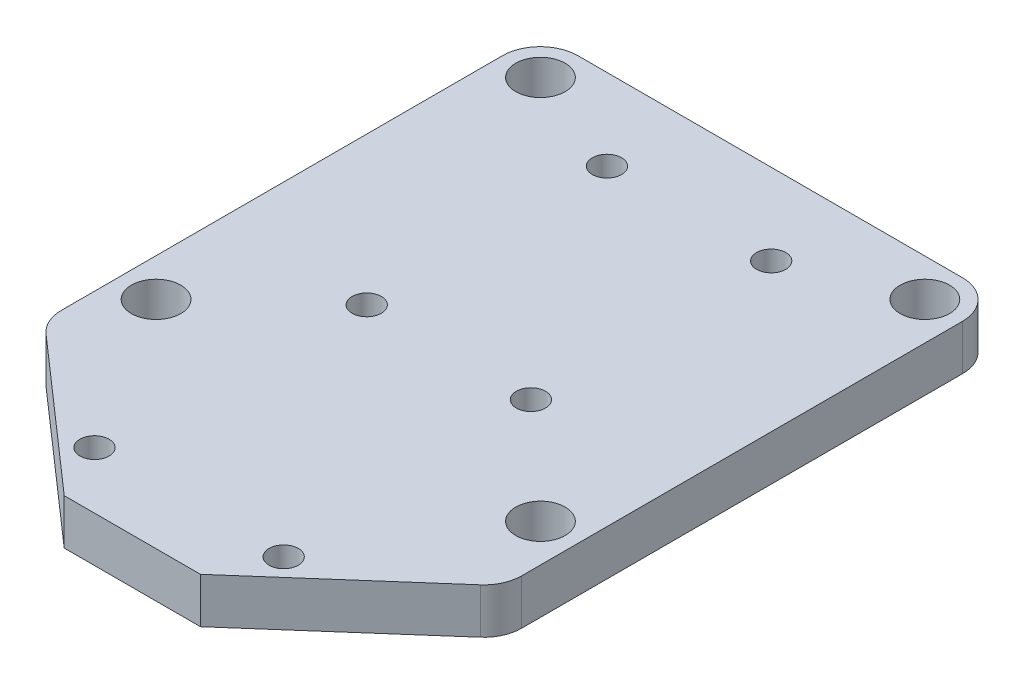
ISO-10303-21;
HEADER;
FILE_DESCRIPTION(('STEP AP214'),'2;1');
FILE_NAME('part.step','',(''),(''),'','','');
FILE_SCHEMA(('AUTOMOTIVE_DESIGN { 1 0 10303 214 1 1 1 1 }'));
ENDSEC;
DATA;
#1=APPLICATION_CONTEXT('core data for automotive mechanical design processes');
#2=APPLICATION_PROTOCOL_DEFINITION('international standard','automotive_design',2000,#1);
#3=PRODUCT_CONTEXT('',#1,'mechanical');
#4=PRODUCT('Part','Part','',(#3));
#5=PRODUCT_RELATED_PRODUCT_CATEGORY('part','',(#4));
#6=PRODUCT_DEFINITION_FORMATION('','',#4);
#7=PRODUCT_DEFINITION_CONTEXT('part definition',#1,'design');
#8=PRODUCT_DEFINITION('design','',#6,#7);
#9=PRODUCT_DEFINITION_SHAPE('','',#8);
#10=(LENGTH_UNIT() NAMED_UNIT(*) SI_UNIT(.MILLI.,.METRE.));
#11=(NAMED_UNIT(*) PLANE_ANGLE_UNIT() SI_UNIT($,.RADIAN.));
#12=(NAMED_UNIT(*) SI_UNIT($,.STERADIAN.) SOLID_ANGLE_UNIT());
#13=UNCERTAINTY_MEASURE_WITH_UNIT(LENGTH_MEASURE(1.E-05),#10,'distance_accuracy_value','');
#14=(GEOMETRIC_REPRESENTATION_CONTEXT(3) GLOBAL_UNCERTAINTY_ASSIGNED_CONTEXT((#13)) GLOBAL_UNIT_ASSIGNED_CONTEXT((#10,
#11,#12)) REPRESENTATION_CONTEXT('',''));
#15=CARTESIAN_POINT('',(0.,0.,0.));
#16=DIRECTION('',(0.,0.,1.));
#17=DIRECTION('',(1.,0.,0.));
#18=AXIS2_PLACEMENT_3D('',#15,#16,#17);
#19=CARTESIAN_POINT('',(-30.4,6.,23.3644057342288));
#20=DIRECTION('',(1.,0.,0.));
#21=DIRECTION('',(0.,0.,-1.));
#22=AXIS2_PLACEMENT_3D('',#19,#20,#21);
#23=PLANE('',#22);
#24=DIRECTION('',(0.,0.,1.));
#25=VECTOR('',#24,1.);
#26=CARTESIAN_POINT('',(-30.4,6.,23.3644057342288));
#27=LINE('',#26,#25);
#28=CARTESIAN_POINT('',(-30.4,6.,-37.15));
#29=VERTEX_POINT('',#28);
#30=CARTESIAN_POINT('',(-30.4,6.,21.1003908041449));
#31=VERTEX_POINT('',#30);
#32=EDGE_CURVE('E124',#29,#31,#27,.T.);
#33=ORIENTED_EDGE('',*,*,#32,.F.);
#34=DIRECTION('',(0.,-1.,0.));
#35=VECTOR('',#34,1.);
#36=CARTESIAN_POINT('',(-30.4,6.,-37.15));
#37=LINE('',#36,#35);
#38=CARTESIAN_POINT('',(-30.4,0.,-37.15));
#39=VERTEX_POINT('',#38);
#40=EDGE_CURVE('E165',#29,#39,#37,.T.);
#41=ORIENTED_EDGE('',*,*,#40,.T.);
#42=DIRECTION('',(0.,0.,1.));
#43=VECTOR('',#42,1.);
#44=CARTESIAN_POINT('',(-30.4,0.,23.3644057342288));
#45=LINE('',#44,#43);
#46=CARTESIAN_POINT('',(-30.4,0.,21.1003908041449));
#47=VERTEX_POINT('',#46);
#48=EDGE_CURVE('E148',#39,#47,#45,.T.);
#49=ORIENTED_EDGE('',*,*,#48,.T.);
#50=DIRECTION('',(0.,-1.,0.));
#51=VECTOR('',#50,1.);
#52=CARTESIAN_POINT('',(-30.4,6.,21.1003908041449));
#53=LINE('',#52,#51);
#54=EDGE_CURVE('E133',#47,#31,#53,.F.);
#55=ORIENTED_EDGE('',*,*,#54,.T.);
#56=EDGE_LOOP('',(#33,#41,#49,#55));
#57=FACE_BOUND('',#56,.T.);
#58=ADVANCED_FACE('F35',(#57),#23,.F.);
#59=CARTESIAN_POINT('',(-9.,6.,42.15));
#60=DIRECTION('',(0.659708967309099,0.,-0.751521176316384));
#61=DIRECTION('',(-0.751521176316384,0.,-0.659708967309099));
#62=AXIS2_PLACEMENT_3D('',#59,#60,#61);
#63=PLANE('',#62);
#64=DIRECTION('',(0.751521176316384,0.,0.659708967309099));
#65=VECTOR('',#64,1.);
#66=CARTESIAN_POINT('',(-9.,6.,42.15));
#67=LINE('',#66,#65);
#68=CARTESIAN_POINT('',(-28.6985448365455,6.,24.8579966857268));
#69=VERTEX_POINT('',#68);
#70=CARTESIAN_POINT('',(-9.,6.,42.15));
#71=VERTEX_POINT('',#70);
#72=EDGE_CURVE('E111',#69,#71,#67,.T.);
#73=ORIENTED_EDGE('',*,*,#72,.F.);
#74=DIRECTION('',(0.,-1.,0.));
#75=VECTOR('',#74,1.);
#76=CARTESIAN_POINT('',(-28.6985448365455,6.,24.8579966857268));
#77=LINE('',#76,#75);
#78=CARTESIAN_POINT('',(-28.6985448365455,0.,24.8579966857268));
#79=VERTEX_POINT('',#78);
#80=EDGE_CURVE('E43',#69,#79,#77,.T.);
#81=ORIENTED_EDGE('',*,*,#80,.T.);
#82=DIRECTION('',(0.751521176316384,0.,0.659708967309099));
#83=VECTOR('',#82,1.);
#84=CARTESIAN_POINT('',(-9.,0.,42.15));
#85=LINE('',#84,#83);
#86=CARTESIAN_POINT('',(-9.,0.,42.15));
#87=VERTEX_POINT('',#86);
#88=EDGE_CURVE('E130',#79,#87,#85,.T.);
#89=ORIENTED_EDGE('',*,*,#88,.T.);
#90=DIRECTION('',(0.,-1.,0.));
#91=VECTOR('',#90,1.);
#92=CARTESIAN_POINT('',(-9.,6.,42.15));
#93=LINE('',#92,#91);
#94=EDGE_CURVE('E127',#71,#87,#93,.T.);
#95=ORIENTED_EDGE('',*,*,#94,.F.);
#96=EDGE_LOOP('',(#73,#81,#89,#95));
#97=FACE_BOUND('',#96,.T.);
#98=ADVANCED_FACE('F128',(#97),#63,.F.);
#99=CARTESIAN_POINT('',(9.,6.,42.15));
#100=DIRECTION('',(0.,0.,-1.));
#101=DIRECTION('',(-1.,0.,0.));
#102=AXIS2_PLACEMENT_3D('',#99,#100,#101);
#103=PLANE('',#102);
#104=DIRECTION('',(1.,0.,0.));
#105=VECTOR('',#104,1.);
#106=CARTESIAN_POINT('',(9.,0.,42.15));
#107=LINE('',#106,#105);
#108=CARTESIAN_POINT('',(9.,0.,42.15));
#109=VERTEX_POINT('',#108);
#110=EDGE_CURVE('E153',#87,#109,#107,.T.);
#111=ORIENTED_EDGE('',*,*,#110,.T.);
#112=DIRECTION('',(0.,-1.,0.));
#113=VECTOR('',#112,1.);
#114=CARTESIAN_POINT('',(9.,6.,42.15));
#115=LINE('',#114,#113);
#116=CARTESIAN_POINT('',(9.,6.,42.15));
#117=VERTEX_POINT('',#116);
#118=EDGE_CURVE('E134',#117,#109,#115,.T.);
#119=ORIENTED_EDGE('',*,*,#118,.F.);
#120=DIRECTION('',(1.,0.,0.));
#121=VECTOR('',#120,1.);
#122=CARTESIAN_POINT('',(9.,6.,42.15));
#123=LINE('',#122,#121);
#124=EDGE_CURVE('E116',#71,#117,#123,.T.);
#125=ORIENTED_EDGE('',*,*,#124,.F.);
#126=ORIENTED_EDGE('',*,*,#94,.T.);
#127=EDGE_LOOP('',(#111,#119,#125,#126));
#128=FACE_BOUND('',#127,.T.);
#129=ADVANCED_FACE('F136',(#128),#103,.F.);
#130=CARTESIAN_POINT('',(9.,6.,42.15));
#131=DIRECTION('',(-0.659708967309099,0.,-0.751521176316384));
#132=DIRECTION('',(-0.751521176316384,0.,0.659708967309099));
#133=AXIS2_PLACEMENT_3D('',#130,#131,#132);
#134=PLANE('',#133);
#135=DIRECTION('',(0.751521176316384,0.,-0.659708967309099));
#136=VECTOR('',#135,1.);
#137=CARTESIAN_POINT('',(9.,0.,42.15));
#138=LINE('',#137,#136);
#139=CARTESIAN_POINT('',(28.6985448365455,0.,24.8579966857268));
#140=VERTEX_POINT('',#139);
#141=EDGE_CURVE('E155',#109,#140,#138,.T.);
#142=ORIENTED_EDGE('',*,*,#141,.T.);
#143=DIRECTION('',(0.,-1.,0.));
#144=VECTOR('',#143,1.);
#145=CARTESIAN_POINT('',(28.6985448365455,6.,24.8579966857268));
#146=LINE('',#145,#144);
#147=CARTESIAN_POINT('',(28.6985448365455,6.,24.8579966857268));
#148=VERTEX_POINT('',#147);
#149=EDGE_CURVE('E11',#140,#148,#146,.F.);
#150=ORIENTED_EDGE('',*,*,#149,.T.);
#151=DIRECTION('',(0.751521176316384,0.,-0.659708967309099));
#152=VECTOR('',#151,1.);
#153=CARTESIAN_POINT('',(9.,6.,42.15));
#154=LINE('',#153,#152);
#155=EDGE_CURVE('E139',#117,#148,#154,.T.);
#156=ORIENTED_EDGE('',*,*,#155,.F.);
#157=ORIENTED_EDGE('',*,*,#118,.T.);
#158=EDGE_LOOP('',(#142,#150,#156,#157));
#159=FACE_BOUND('',#158,.T.);
#160=ADVANCED_FACE('F196',(#159),#134,.F.);
#161=CARTESIAN_POINT('',(30.4,6.,23.3644057342288));
#162=DIRECTION('',(-1.,0.,0.));
#163=DIRECTION('',(0.,0.,1.));
#164=AXIS2_PLACEMENT_3D('',#161,#162,#163);
#165=PLANE('',#164);
#166=DIRECTION('',(0.,0.,-1.));
#167=VECTOR('',#166,1.);
#168=CARTESIAN_POINT('',(30.4,0.,23.3644057342288));
#169=LINE('',#168,#167);
#170=CARTESIAN_POINT('',(30.4,0.,21.1003908041449));
#171=VERTEX_POINT('',#170);
#172=CARTESIAN_POINT('',(30.4,0.,-37.15));
#173=VERTEX_POINT('',#172);
#174=EDGE_CURVE('E158',#171,#173,#169,.T.);
#175=ORIENTED_EDGE('',*,*,#174,.T.);
#176=DIRECTION('',(0.,-1.,0.));
#177=VECTOR('',#176,1.);
#178=CARTESIAN_POINT('',(30.4,6.,-37.15));
#179=LINE('',#178,#177);
#180=CARTESIAN_POINT('',(30.4,6.,-37.15));
#181=VERTEX_POINT('',#180);
#182=EDGE_CURVE('E50',#173,#181,#179,.F.);
#183=ORIENTED_EDGE('',*,*,#182,.T.);
#184=DIRECTION('',(0.,0.,-1.));
#185=VECTOR('',#184,1.);
#186=CARTESIAN_POINT('',(30.4,6.,23.3644057342288));
#187=LINE('',#186,#185);
#188=CARTESIAN_POINT('',(30.4,6.,21.1003908041449));
#189=VERTEX_POINT('',#188);
#190=EDGE_CURVE('E141',#189,#181,#187,.T.);
#191=ORIENTED_EDGE('',*,*,#190,.F.);
#192=DIRECTION('',(0.,-1.,0.));
#193=VECTOR('',#192,1.);
#194=CARTESIAN_POINT('',(30.4,6.,21.1003908041449));
#195=LINE('',#194,#193);
#196=EDGE_CURVE('E187',#189,#171,#195,.T.);
#197=ORIENTED_EDGE('',*,*,#196,.T.);
#198=EDGE_LOOP('',(#175,#183,#191,#197));
#199=FACE_BOUND('',#198,.T.);
#200=ADVANCED_FACE('F201',(#199),#165,.F.);
#201=CARTESIAN_POINT('',(30.4,6.,-42.15));
#202=DIRECTION('',(0.,0.,1.));
#203=DIRECTION('',(1.,0.,0.));
#204=AXIS2_PLACEMENT_3D('',#201,#202,#203);
#205=PLANE('',#204);
#206=DIRECTION('',(-1.,0.,0.));
#207=VECTOR('',#206,1.);
#208=CARTESIAN_POINT('',(30.4,0.,-42.15));
#209=LINE('',#208,#207);
#210=CARTESIAN_POINT('',(25.4,0.,-42.15));
#211=VERTEX_POINT('',#210);
#212=CARTESIAN_POINT('',(-25.4,0.,-42.15));
#213=VERTEX_POINT('',#212);
#214=EDGE_CURVE('E160',#211,#213,#209,.T.);
#215=ORIENTED_EDGE('',*,*,#214,.T.);
#216=DIRECTION('',(0.,-1.,0.));
#217=VECTOR('',#216,1.);
#218=CARTESIAN_POINT('',(-25.4,6.,-42.15));
#219=LINE('',#218,#217);
#220=CARTESIAN_POINT('',(-25.4,6.,-42.15));
#221=VERTEX_POINT('',#220);
#222=EDGE_CURVE('E179',#213,#221,#219,.F.);
#223=ORIENTED_EDGE('',*,*,#222,.T.);
#224=DIRECTION('',(-1.,0.,0.));
#225=VECTOR('',#224,1.);
#226=CARTESIAN_POINT('',(30.4,6.,-42.15));
#227=LINE('',#226,#225);
#228=CARTESIAN_POINT('',(25.4,6.,-42.15));
#229=VERTEX_POINT('',#228);
#230=EDGE_CURVE('E146',#229,#221,#227,.T.);
#231=ORIENTED_EDGE('',*,*,#230,.F.);
#232=DIRECTION('',(0.,-1.,0.));
#233=VECTOR('',#232,1.);
#234=CARTESIAN_POINT('',(25.4,6.,-42.15));
#235=LINE('',#234,#233);
#236=EDGE_CURVE('E176',#229,#211,#235,.T.);
#237=ORIENTED_EDGE('',*,*,#236,.T.);
#238=EDGE_LOOP('',(#215,#223,#231,#237));
#239=FACE_BOUND('',#238,.T.);
#240=ADVANCED_FACE('F209',(#239),#205,.F.);
#241=CARTESIAN_POINT('',(0.,6.,0.));
#242=DIRECTION('',(0.,1.,0.));
#243=DIRECTION('',(0.,0.,1.));
#244=AXIS2_PLACEMENT_3D('',#241,#242,#243);
#245=PLANE('',#244);
#246=CARTESIAN_POINT('',(25.4,6.,-37.185));
#247=DIRECTION('',(0.,1.,0.));
#248=DIRECTION('',(0.,0.,1.));
#249=AXIS2_PLACEMENT_3D('',#246,#247,#248);
#250=CIRCLE('',#249,3.2639);
#251=CARTESIAN_POINT('',(25.4,6.,-33.9211));
#252=VERTEX_POINT('',#251);
#253=EDGE_CURVE('E275',#252,#252,#250,.T.);
#254=ORIENTED_EDGE('',*,*,#253,.F.);
#255=EDGE_LOOP('',(#254));
#256=FACE_BOUND('',#255,.T.);
#257=CARTESIAN_POINT('',(-25.4,6.,-37.185));
#258=DIRECTION('',(0.,1.,0.));
#259=DIRECTION('',(0.,0.,1.));
#260=AXIS2_PLACEMENT_3D('',#257,#258,#259);
#261=CIRCLE('',#260,3.2639);
#262=CARTESIAN_POINT('',(-25.4,6.,-33.9211));
#263=VERTEX_POINT('',#262);
#264=EDGE_CURVE('E269',#263,#263,#261,.T.);
#265=ORIENTED_EDGE('',*,*,#264,.F.);
#266=EDGE_LOOP('',(#265));
#267=FACE_BOUND('',#266,.T.);
#268=CARTESIAN_POINT('',(-25.4,6.,13.615));
#269=DIRECTION('',(0.,1.,0.));
#270=DIRECTION('',(0.,0.,1.));
#271=AXIS2_PLACEMENT_3D('',#268,#269,#270);
#272=CIRCLE('',#271,3.2639);
#273=CARTESIAN_POINT('',(-25.4,6.,16.8789));
#274=VERTEX_POINT('',#273);
#275=EDGE_CURVE('E263',#274,#274,#272,.T.);
#276=ORIENTED_EDGE('',*,*,#275,.F.);
#277=EDGE_LOOP('',(#276));
#278=FACE_BOUND('',#277,.T.);
#279=CARTESIAN_POINT('',(25.4,6.,13.615));
#280=DIRECTION('',(0.,1.,0.));
#281=DIRECTION('',(0.,0.,1.));
#282=AXIS2_PLACEMENT_3D('',#279,#280,#281);
#283=CIRCLE('',#282,3.2639);
#284=CARTESIAN_POINT('',(25.4,6.,16.8789));
#285=VERTEX_POINT('',#284);
#286=EDGE_CURVE('E257',#285,#285,#283,.T.);
#287=ORIENTED_EDGE('',*,*,#286,.F.);
#288=EDGE_LOOP('',(#287));
#289=FACE_BOUND('',#288,.T.);
#290=CARTESIAN_POINT('',(10.85,6.,0.325000000000049));
#291=DIRECTION('',(0.,1.,0.));
#292=DIRECTION('',(0.,0.,1.));
#293=AXIS2_PLACEMENT_3D('',#290,#291,#292);
#294=CIRCLE('',#293,1.9304);
#295=CARTESIAN_POINT('',(10.85,6.,2.25540000000005));
#296=VERTEX_POINT('',#295);
#297=EDGE_CURVE('E251',#296,#296,#294,.T.);
#298=ORIENTED_EDGE('',*,*,#297,.F.);
#299=EDGE_LOOP('',(#298));
#300=FACE_BOUND('',#299,.T.);
#301=CARTESIAN_POINT('',(-10.85,6.,0.325000000000049));
#302=DIRECTION('',(0.,1.,0.));
#303=DIRECTION('',(0.,0.,1.));
#304=AXIS2_PLACEMENT_3D('',#301,#302,#303);
#305=CIRCLE('',#304,1.9304);
#306=CARTESIAN_POINT('',(-10.85,6.,2.25540000000005));
#307=VERTEX_POINT('',#306);
#308=EDGE_CURVE('E245',#307,#307,#305,.T.);
#309=ORIENTED_EDGE('',*,*,#308,.F.);
#310=EDGE_LOOP('',(#309));
#311=FACE_BOUND('',#310,.T.);
#312=CARTESIAN_POINT('',(-10.85,6.,-31.425));
#313=DIRECTION('',(0.,1.,0.));
#314=DIRECTION('',(0.,0.,1.));
#315=AXIS2_PLACEMENT_3D('',#312,#313,#314);
#316=CIRCLE('',#315,1.9304);
#317=CARTESIAN_POINT('',(-10.85,6.,-29.4946));
#318=VERTEX_POINT('',#317);
#319=EDGE_CURVE('E239',#318,#318,#316,.T.);
#320=ORIENTED_EDGE('',*,*,#319,.F.);
#321=EDGE_LOOP('',(#320));
#322=FACE_BOUND('',#321,.T.);
#323=CARTESIAN_POINT('',(10.85,6.,-31.425));
#324=DIRECTION('',(0.,1.,0.));
#325=DIRECTION('',(0.,0.,1.));
#326=AXIS2_PLACEMENT_3D('',#323,#324,#325);
#327=CIRCLE('',#326,1.9304);
#328=CARTESIAN_POINT('',(10.85,6.,-29.4946));
#329=VERTEX_POINT('',#328);
#330=EDGE_CURVE('E233',#329,#329,#327,.T.);
#331=ORIENTED_EDGE('',*,*,#330,.F.);
#332=EDGE_LOOP('',(#331));
#333=FACE_BOUND('',#332,.T.);
#334=CARTESIAN_POINT('',(12.5,6.,34.65));
#335=DIRECTION('',(0.,1.,0.));
#336=DIRECTION('',(0.,0.,1.));
#337=AXIS2_PLACEMENT_3D('',#334,#335,#336);
#338=CIRCLE('',#337,1.9304);
#339=CARTESIAN_POINT('',(12.5,6.,36.5804));
#340=VERTEX_POINT('',#339);
#341=EDGE_CURVE('E227',#340,#340,#338,.T.);
#342=ORIENTED_EDGE('',*,*,#341,.F.);
#343=EDGE_LOOP('',(#342));
#344=FACE_BOUND('',#343,.T.);
#345=CARTESIAN_POINT('',(-12.5,6.,34.65));
#346=DIRECTION('',(0.,1.,0.));
#347=DIRECTION('',(0.,0.,1.));
#348=AXIS2_PLACEMENT_3D('',#345,#346,#347);
#349=CIRCLE('',#348,1.9304);
#350=CARTESIAN_POINT('',(-12.5,6.,36.5804));
#351=VERTEX_POINT('',#350);
#352=EDGE_CURVE('E221',#351,#351,#349,.T.);
#353=ORIENTED_EDGE('',*,*,#352,.F.);
#354=EDGE_LOOP('',(#353));
#355=FACE_BOUND('',#354,.T.);
#356=ORIENTED_EDGE('',*,*,#230,.T.);
#357=CARTESIAN_POINT('',(-25.4,6.,-37.15));
#358=DIRECTION('',(0.,1.,0.));
#359=DIRECTION('',(0.,0.,1.));
#360=AXIS2_PLACEMENT_3D('',#357,#358,#359);
#361=CIRCLE('',#360,5.);
#362=EDGE_CURVE('E185',#221,#29,#361,.T.);
#363=ORIENTED_EDGE('',*,*,#362,.T.);
#364=ORIENTED_EDGE('',*,*,#32,.T.);
#365=CARTESIAN_POINT('',(-25.4,6.,21.1003908041449));
#366=DIRECTION('',(0.,1.,0.));
#367=DIRECTION('',(0.,0.,1.));
#368=AXIS2_PLACEMENT_3D('',#365,#366,#367);
#369=CIRCLE('',#368,5.);
#370=EDGE_CURVE('E120',#31,#69,#369,.T.);
#371=ORIENTED_EDGE('',*,*,#370,.T.);
#372=ORIENTED_EDGE('',*,*,#72,.T.);
#373=ORIENTED_EDGE('',*,*,#124,.T.);
#374=ORIENTED_EDGE('',*,*,#155,.T.);
#375=CARTESIAN_POINT('',(25.4,6.,21.1003908041449));
#376=DIRECTION('',(0.,1.,0.));
#377=DIRECTION('',(0.,0.,1.));
#378=AXIS2_PLACEMENT_3D('',#375,#376,#377);
#379=CIRCLE('',#378,5.);
#380=EDGE_CURVE('E57',#148,#189,#379,.T.);
#381=ORIENTED_EDGE('',*,*,#380,.T.);
#382=ORIENTED_EDGE('',*,*,#190,.T.);
#383=CARTESIAN_POINT('',(25.4,6.,-37.15));
#384=DIRECTION('',(0.,1.,0.));
#385=DIRECTION('',(0.,0.,1.));
#386=AXIS2_PLACEMENT_3D('',#383,#384,#385);
#387=CIRCLE('',#386,5.);
#388=EDGE_CURVE('E183',#181,#229,#387,.T.);
#389=ORIENTED_EDGE('',*,*,#388,.T.);
#390=EDGE_LOOP('',(#356,#363,#364,#371,#372,#373,#374,#381,#382,#389));
#391=FACE_BOUND('',#390,.T.);
#392=ADVANCED_FACE('F114',(#256,#267,#278,#289,#300,#311,#322,#333,#344,#355,#391),#245,.T.);
#393=CARTESIAN_POINT('',(0.,0.,0.));
#394=DIRECTION('',(0.,1.,0.));
#395=DIRECTION('',(0.,0.,1.));
#396=AXIS2_PLACEMENT_3D('',#393,#394,#395);
#397=PLANE('',#396);
#398=CARTESIAN_POINT('',(25.4,0.,-37.185));
#399=DIRECTION('',(0.,1.,0.));
#400=DIRECTION('',(0.,0.,1.));
#401=AXIS2_PLACEMENT_3D('',#398,#399,#400);
#402=CIRCLE('',#401,3.2639);
#403=CARTESIAN_POINT('',(25.4,0.,-33.9211));
#404=VERTEX_POINT('',#403);
#405=EDGE_CURVE('E272',#404,#404,#402,.T.);
#406=ORIENTED_EDGE('',*,*,#405,.T.);
#407=EDGE_LOOP('',(#406));
#408=FACE_BOUND('',#407,.T.);
#409=CARTESIAN_POINT('',(-25.4,0.,-37.185));
#410=DIRECTION('',(0.,1.,0.));
#411=DIRECTION('',(0.,0.,1.));
#412=AXIS2_PLACEMENT_3D('',#409,#410,#411);
#413=CIRCLE('',#412,3.2639);
#414=CARTESIAN_POINT('',(-25.4,0.,-33.9211));
#415=VERTEX_POINT('',#414);
#416=EDGE_CURVE('E266',#415,#415,#413,.T.);
#417=ORIENTED_EDGE('',*,*,#416,.T.);
#418=EDGE_LOOP('',(#417));
#419=FACE_BOUND('',#418,.T.);
#420=CARTESIAN_POINT('',(-25.4,0.,13.615));
#421=DIRECTION('',(0.,1.,0.));
#422=DIRECTION('',(0.,0.,1.));
#423=AXIS2_PLACEMENT_3D('',#420,#421,#422);
#424=CIRCLE('',#423,3.2639);
#425=CARTESIAN_POINT('',(-25.4,0.,16.8789));
#426=VERTEX_POINT('',#425);
#427=EDGE_CURVE('E260',#426,#426,#424,.T.);
#428=ORIENTED_EDGE('',*,*,#427,.T.);
#429=EDGE_LOOP('',(#428));
#430=FACE_BOUND('',#429,.T.);
#431=CARTESIAN_POINT('',(25.4,0.,13.615));
#432=DIRECTION('',(0.,1.,0.));
#433=DIRECTION('',(0.,0.,1.));
#434=AXIS2_PLACEMENT_3D('',#431,#432,#433);
#435=CIRCLE('',#434,3.2639);
#436=CARTESIAN_POINT('',(25.4,0.,16.8789));
#437=VERTEX_POINT('',#436);
#438=EDGE_CURVE('E254',#437,#437,#435,.T.);
#439=ORIENTED_EDGE('',*,*,#438,.T.);
#440=EDGE_LOOP('',(#439));
#441=FACE_BOUND('',#440,.T.);
#442=CARTESIAN_POINT('',(10.85,0.,0.325000000000049));
#443=DIRECTION('',(0.,1.,0.));
#444=DIRECTION('',(0.,0.,1.));
#445=AXIS2_PLACEMENT_3D('',#442,#443,#444);
#446=CIRCLE('',#445,1.9304);
#447=CARTESIAN_POINT('',(10.85,0.,2.25540000000005));
#448=VERTEX_POINT('',#447);
#449=EDGE_CURVE('E248',#448,#448,#446,.T.);
#450=ORIENTED_EDGE('',*,*,#449,.T.);
#451=EDGE_LOOP('',(#450));
#452=FACE_BOUND('',#451,.T.);
#453=CARTESIAN_POINT('',(-10.85,0.,0.325000000000049));
#454=DIRECTION('',(0.,1.,0.));
#455=DIRECTION('',(0.,0.,1.));
#456=AXIS2_PLACEMENT_3D('',#453,#454,#455);
#457=CIRCLE('',#456,1.9304);
#458=CARTESIAN_POINT('',(-10.85,0.,2.25540000000005));
#459=VERTEX_POINT('',#458);
#460=EDGE_CURVE('E242',#459,#459,#457,.T.);
#461=ORIENTED_EDGE('',*,*,#460,.T.);
#462=EDGE_LOOP('',(#461));
#463=FACE_BOUND('',#462,.T.);
#464=CARTESIAN_POINT('',(-10.85,0.,-31.425));
#465=DIRECTION('',(0.,1.,0.));
#466=DIRECTION('',(0.,0.,1.));
#467=AXIS2_PLACEMENT_3D('',#464,#465,#466);
#468=CIRCLE('',#467,1.9304);
#469=CARTESIAN_POINT('',(-10.85,0.,-29.4946));
#470=VERTEX_POINT('',#469);
#471=EDGE_CURVE('E236',#470,#470,#468,.T.);
#472=ORIENTED_EDGE('',*,*,#471,.T.);
#473=EDGE_LOOP('',(#472));
#474=FACE_BOUND('',#473,.T.);
#475=CARTESIAN_POINT('',(10.85,0.,-31.425));
#476=DIRECTION('',(0.,1.,0.));
#477=DIRECTION('',(0.,0.,1.));
#478=AXIS2_PLACEMENT_3D('',#475,#476,#477);
#479=CIRCLE('',#478,1.9304);
#480=CARTESIAN_POINT('',(10.85,0.,-29.4946));
#481=VERTEX_POINT('',#480);
#482=EDGE_CURVE('E230',#481,#481,#479,.T.);
#483=ORIENTED_EDGE('',*,*,#482,.T.);
#484=EDGE_LOOP('',(#483));
#485=FACE_BOUND('',#484,.T.);
#486=CARTESIAN_POINT('',(12.5,0.,34.65));
#487=DIRECTION('',(0.,1.,0.));
#488=DIRECTION('',(0.,0.,1.));
#489=AXIS2_PLACEMENT_3D('',#486,#487,#488);
#490=CIRCLE('',#489,1.9304);
#491=CARTESIAN_POINT('',(12.5,0.,36.5804));
#492=VERTEX_POINT('',#491);
#493=EDGE_CURVE('E224',#492,#492,#490,.T.);
#494=ORIENTED_EDGE('',*,*,#493,.T.);
#495=EDGE_LOOP('',(#494));
#496=FACE_BOUND('',#495,.T.);
#497=CARTESIAN_POINT('',(-12.5,0.,34.65));
#498=DIRECTION('',(0.,1.,0.));
#499=DIRECTION('',(0.,0.,1.));
#500=AXIS2_PLACEMENT_3D('',#497,#498,#499);
#501=CIRCLE('',#500,1.9304);
#502=CARTESIAN_POINT('',(-12.5,0.,36.5804));
#503=VERTEX_POINT('',#502);
#504=EDGE_CURVE('E151',#503,#503,#501,.T.);
#505=ORIENTED_EDGE('',*,*,#504,.T.);
#506=EDGE_LOOP('',(#505));
#507=FACE_BOUND('',#506,.T.);
#508=ORIENTED_EDGE('',*,*,#48,.F.);
#509=CARTESIAN_POINT('',(-25.4,0.,-37.15));
#510=DIRECTION('',(0.,1.,0.));
#511=DIRECTION('',(0.,0.,1.));
#512=AXIS2_PLACEMENT_3D('',#509,#510,#511);
#513=CIRCLE('',#512,5.);
#514=EDGE_CURVE('E174',#39,#213,#513,.F.);
#515=ORIENTED_EDGE('',*,*,#514,.T.);
#516=ORIENTED_EDGE('',*,*,#214,.F.);
#517=CARTESIAN_POINT('',(25.4,0.,-37.15));
#518=DIRECTION('',(0.,1.,0.));
#519=DIRECTION('',(0.,0.,1.));
#520=AXIS2_PLACEMENT_3D('',#517,#518,#519);
#521=CIRCLE('',#520,5.);
#522=EDGE_CURVE('E172',#211,#173,#521,.F.);
#523=ORIENTED_EDGE('',*,*,#522,.T.);
#524=ORIENTED_EDGE('',*,*,#174,.F.);
#525=CARTESIAN_POINT('',(25.4,0.,21.1003908041449));
#526=DIRECTION('',(0.,1.,0.));
#527=DIRECTION('',(0.,0.,1.));
#528=AXIS2_PLACEMENT_3D('',#525,#526,#527);
#529=CIRCLE('',#528,5.);
#530=EDGE_CURVE('E168',#171,#140,#529,.F.);
#531=ORIENTED_EDGE('',*,*,#530,.T.);
#532=ORIENTED_EDGE('',*,*,#141,.F.);
#533=ORIENTED_EDGE('',*,*,#110,.F.);
#534=ORIENTED_EDGE('',*,*,#88,.F.);
#535=CARTESIAN_POINT('',(-25.4,0.,21.1003908041449));
#536=DIRECTION('',(0.,1.,0.));
#537=DIRECTION('',(0.,0.,1.));
#538=AXIS2_PLACEMENT_3D('',#535,#536,#537);
#539=CIRCLE('',#538,5.);
#540=EDGE_CURVE('E170',#79,#47,#539,.F.);
#541=ORIENTED_EDGE('',*,*,#540,.T.);
#542=EDGE_LOOP('',(#508,#515,#516,#523,#524,#531,#532,#533,#534,#541));
#543=FACE_BOUND('',#542,.T.);
#544=ADVANCED_FACE('F193',(#408,#419,#430,#441,#452,#463,#474,#485,#496,#507,#543),#397,.F.);
#545=CARTESIAN_POINT('',(-25.4,6.,-37.15));
#546=DIRECTION('',(0.,-1.,0.));
#547=DIRECTION('',(0.,0.,-1.));
#548=AXIS2_PLACEMENT_3D('',#545,#546,#547);
#549=CYLINDRICAL_SURFACE('',#548,5.);
#550=ORIENTED_EDGE('',*,*,#362,.F.);
#551=ORIENTED_EDGE('',*,*,#222,.F.);
#552=ORIENTED_EDGE('',*,*,#514,.F.);
#553=ORIENTED_EDGE('',*,*,#40,.F.);
#554=EDGE_LOOP('',(#550,#551,#552,#553));
#555=FACE_BOUND('',#554,.T.);
#556=ADVANCED_FACE('F215',(#555),#549,.T.);
#557=CARTESIAN_POINT('',(25.4,6.,-37.15));
#558=DIRECTION('',(0.,-1.,0.));
#559=DIRECTION('',(0.,0.,-1.));
#560=AXIS2_PLACEMENT_3D('',#557,#558,#559);
#561=CYLINDRICAL_SURFACE('',#560,5.);
#562=ORIENTED_EDGE('',*,*,#388,.F.);
#563=ORIENTED_EDGE('',*,*,#182,.F.);
#564=ORIENTED_EDGE('',*,*,#522,.F.);
#565=ORIENTED_EDGE('',*,*,#236,.F.);
#566=EDGE_LOOP('',(#562,#563,#564,#565));
#567=FACE_BOUND('',#566,.T.);
#568=ADVANCED_FACE('F206',(#567),#561,.T.);
#569=CARTESIAN_POINT('',(-25.4,6.,21.1003908041449));
#570=DIRECTION('',(0.,-1.,0.));
#571=DIRECTION('',(0.,0.,-1.));
#572=AXIS2_PLACEMENT_3D('',#569,#570,#571);
#573=CYLINDRICAL_SURFACE('',#572,5.);
#574=ORIENTED_EDGE('',*,*,#370,.F.);
#575=ORIENTED_EDGE('',*,*,#54,.F.);
#576=ORIENTED_EDGE('',*,*,#540,.F.);
#577=ORIENTED_EDGE('',*,*,#80,.F.);
#578=EDGE_LOOP('',(#574,#575,#576,#577));
#579=FACE_BOUND('',#578,.T.);
#580=ADVANCED_FACE('F314',(#579),#573,.T.);
#581=CARTESIAN_POINT('',(25.4,6.,21.1003908041449));
#582=DIRECTION('',(0.,-1.,0.));
#583=DIRECTION('',(0.,0.,-1.));
#584=AXIS2_PLACEMENT_3D('',#581,#582,#583);
#585=CYLINDRICAL_SURFACE('',#584,5.);
#586=ORIENTED_EDGE('',*,*,#380,.F.);
#587=ORIENTED_EDGE('',*,*,#149,.F.);
#588=ORIENTED_EDGE('',*,*,#530,.F.);
#589=ORIENTED_EDGE('',*,*,#196,.F.);
#590=EDGE_LOOP('',(#586,#587,#588,#589));
#591=FACE_BOUND('',#590,.T.);
#592=ADVANCED_FACE('F37',(#591),#585,.T.);
#593=CARTESIAN_POINT('',(-12.5,6.,34.65));
#594=DIRECTION('',(0.,1.,0.));
#595=DIRECTION('',(0.,0.,1.));
#596=AXIS2_PLACEMENT_3D('',#593,#594,#595);
#597=CYLINDRICAL_SURFACE('',#596,1.9304);
#598=ORIENTED_EDGE('',*,*,#504,.F.);
#599=EDGE_LOOP('',(#598));
#600=FACE_BOUND('',#599,.T.);
#601=ORIENTED_EDGE('',*,*,#352,.T.);
#602=EDGE_LOOP('',(#601));
#603=FACE_BOUND('',#602,.T.);
#604=ADVANCED_FACE('F302',(#600,#603),#597,.F.);
#605=CARTESIAN_POINT('',(12.5,6.,34.65));
#606=DIRECTION('',(0.,1.,0.));
#607=DIRECTION('',(0.,0.,1.));
#608=AXIS2_PLACEMENT_3D('',#605,#606,#607);
#609=CYLINDRICAL_SURFACE('',#608,1.9304);
#610=ORIENTED_EDGE('',*,*,#493,.F.);
#611=EDGE_LOOP('',(#610));
#612=FACE_BOUND('',#611,.T.);
#613=ORIENTED_EDGE('',*,*,#341,.T.);
#614=EDGE_LOOP('',(#613));
#615=FACE_BOUND('',#614,.T.);
#616=ADVANCED_FACE('F304',(#612,#615),#609,.F.);
#617=CARTESIAN_POINT('',(10.85,6.,-31.425));
#618=DIRECTION('',(0.,1.,0.));
#619=DIRECTION('',(0.,0.,1.));
#620=AXIS2_PLACEMENT_3D('',#617,#618,#619);
#621=CYLINDRICAL_SURFACE('',#620,1.9304);
#622=ORIENTED_EDGE('',*,*,#482,.F.);
#623=EDGE_LOOP('',(#622));
#624=FACE_BOUND('',#623,.T.);
#625=ORIENTED_EDGE('',*,*,#330,.T.);
#626=EDGE_LOOP('',(#625));
#627=FACE_BOUND('',#626,.T.);
#628=ADVANCED_FACE('F311',(#624,#627),#621,.F.);
#629=CARTESIAN_POINT('',(-10.85,6.,-31.425));
#630=DIRECTION('',(0.,1.,0.));
#631=DIRECTION('',(0.,0.,1.));
#632=AXIS2_PLACEMENT_3D('',#629,#630,#631);
#633=CYLINDRICAL_SURFACE('',#632,1.9304);
#634=ORIENTED_EDGE('',*,*,#471,.F.);
#635=EDGE_LOOP('',(#634));
#636=FACE_BOUND('',#635,.T.);
#637=ORIENTED_EDGE('',*,*,#319,.T.);
#638=EDGE_LOOP('',(#637));
#639=FACE_BOUND('',#638,.T.);
#640=ADVANCED_FACE('F359',(#636,#639),#633,.F.);
#641=CARTESIAN_POINT('',(-10.85,6.,0.325000000000049));
#642=DIRECTION('',(0.,1.,0.));
#643=DIRECTION('',(0.,0.,1.));
#644=AXIS2_PLACEMENT_3D('',#641,#642,#643);
#645=CYLINDRICAL_SURFACE('',#644,1.9304);
#646=ORIENTED_EDGE('',*,*,#460,.F.);
#647=EDGE_LOOP('',(#646));
#648=FACE_BOUND('',#647,.T.);
#649=ORIENTED_EDGE('',*,*,#308,.T.);
#650=EDGE_LOOP('',(#649));
#651=FACE_BOUND('',#650,.T.);
#652=ADVANCED_FACE('F370',(#648,#651),#645,.F.);
#653=CARTESIAN_POINT('',(10.85,6.,0.325000000000049));
#654=DIRECTION('',(0.,1.,0.));
#655=DIRECTION('',(0.,0.,1.));
#656=AXIS2_PLACEMENT_3D('',#653,#654,#655);
#657=CYLINDRICAL_SURFACE('',#656,1.9304);
#658=ORIENTED_EDGE('',*,*,#449,.F.);
#659=EDGE_LOOP('',(#658));
#660=FACE_BOUND('',#659,.T.);
#661=ORIENTED_EDGE('',*,*,#297,.T.);
#662=EDGE_LOOP('',(#661));
#663=FACE_BOUND('',#662,.T.);
#664=ADVANCED_FACE('F381',(#660,#663),#657,.F.);
#665=CARTESIAN_POINT('',(25.4,6.,13.615));
#666=DIRECTION('',(0.,1.,0.));
#667=DIRECTION('',(0.,0.,1.));
#668=AXIS2_PLACEMENT_3D('',#665,#666,#667);
#669=CYLINDRICAL_SURFACE('',#668,3.2639);
#670=ORIENTED_EDGE('',*,*,#438,.F.);
#671=EDGE_LOOP('',(#670));
#672=FACE_BOUND('',#671,.T.);
#673=ORIENTED_EDGE('',*,*,#286,.T.);
#674=EDGE_LOOP('',(#673));
#675=FACE_BOUND('',#674,.T.);
#676=ADVANCED_FACE('F392',(#672,#675),#669,.F.);
#677=CARTESIAN_POINT('',(-25.4,6.,13.615));
#678=DIRECTION('',(0.,1.,0.));
#679=DIRECTION('',(0.,0.,1.));
#680=AXIS2_PLACEMENT_3D('',#677,#678,#679);
#681=CYLINDRICAL_SURFACE('',#680,3.2639);
#682=ORIENTED_EDGE('',*,*,#427,.F.);
#683=EDGE_LOOP('',(#682));
#684=FACE_BOUND('',#683,.T.);
#685=ORIENTED_EDGE('',*,*,#275,.T.);
#686=EDGE_LOOP('',(#685));
#687=FACE_BOUND('',#686,.T.);
#688=ADVANCED_FACE('F420',(#684,#687),#681,.F.);
#689=CARTESIAN_POINT('',(-25.4,6.,-37.185));
#690=DIRECTION('',(0.,1.,0.));
#691=DIRECTION('',(0.,0.,1.));
#692=AXIS2_PLACEMENT_3D('',#689,#690,#691);
#693=CYLINDRICAL_SURFACE('',#692,3.2639);
#694=ORIENTED_EDGE('',*,*,#416,.F.);
#695=EDGE_LOOP('',(#694));
#696=FACE_BOUND('',#695,.T.);
#697=ORIENTED_EDGE('',*,*,#264,.T.);
#698=EDGE_LOOP('',(#697));
#699=FACE_BOUND('',#698,.T.);
#700=ADVANCED_FACE('F430',(#696,#699),#693,.F.);
#701=CARTESIAN_POINT('',(25.4,6.,-37.185));
#702=DIRECTION('',(0.,1.,0.));
#703=DIRECTION('',(0.,0.,1.));
#704=AXIS2_PLACEMENT_3D('',#701,#702,#703);
#705=CYLINDRICAL_SURFACE('',#704,3.2639);
#706=ORIENTED_EDGE('',*,*,#405,.F.);
#707=EDGE_LOOP('',(#706));
#708=FACE_BOUND('',#707,.T.);
#709=ORIENTED_EDGE('',*,*,#253,.T.);
#710=EDGE_LOOP('',(#709));
#711=FACE_BOUND('',#710,.T.);
#712=ADVANCED_FACE('F279',(#708,#711),#705,.F.);
#713=CLOSED_SHELL('',(#58,#98,#129,#160,#200,#240,#392,#544,#556,#568,#580,#592,#604,#616,#628,
#640,#652,#664,#676,#688,#700,#712));
#714=MANIFOLD_SOLID_BREP('B2',#713);
#715=ADVANCED_BREP_SHAPE_REPRESENTATION('',(#18,#714),#14);
#716=SHAPE_DEFINITION_REPRESENTATION(#9,#715);
ENDSEC;
END-ISO-10303-21;
